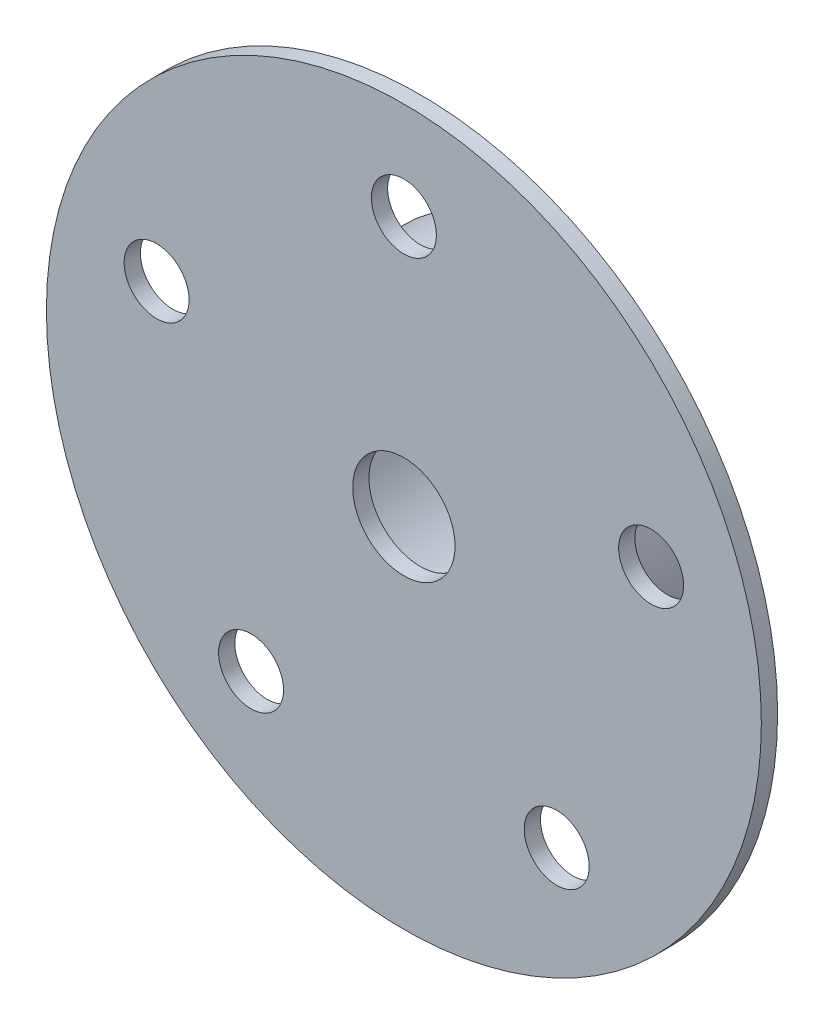
ISO-10303-21;
HEADER;
FILE_DESCRIPTION(('STEP AP214'),'2;1');
FILE_NAME('part.step','',(''),(''),'','','');
FILE_SCHEMA(('AUTOMOTIVE_DESIGN { 1 0 10303 214 1 1 1 1 }'));
ENDSEC;
DATA;
#1=APPLICATION_CONTEXT('core data for automotive mechanical design processes');
#2=APPLICATION_PROTOCOL_DEFINITION('international standard','automotive_design',2000,#1);
#3=PRODUCT_CONTEXT('',#1,'mechanical');
#4=PRODUCT('Part','Part','',(#3));
#5=PRODUCT_RELATED_PRODUCT_CATEGORY('part','',(#4));
#6=PRODUCT_DEFINITION_FORMATION('','',#4);
#7=PRODUCT_DEFINITION_CONTEXT('part definition',#1,'design');
#8=PRODUCT_DEFINITION('design','',#6,#7);
#9=PRODUCT_DEFINITION_SHAPE('','',#8);
#10=(LENGTH_UNIT() NAMED_UNIT(*) SI_UNIT(.MILLI.,.METRE.));
#11=(NAMED_UNIT(*) PLANE_ANGLE_UNIT() SI_UNIT($,.RADIAN.));
#12=(NAMED_UNIT(*) SI_UNIT($,.STERADIAN.) SOLID_ANGLE_UNIT());
#13=UNCERTAINTY_MEASURE_WITH_UNIT(LENGTH_MEASURE(1.E-05),#10,'distance_accuracy_value','');
#14=(GEOMETRIC_REPRESENTATION_CONTEXT(3) GLOBAL_UNCERTAINTY_ASSIGNED_CONTEXT((#13)) GLOBAL_UNIT_ASSIGNED_CONTEXT((#10,
#11,#12)) REPRESENTATION_CONTEXT('',''));
#15=CARTESIAN_POINT('',(0.,0.,0.));
#16=DIRECTION('',(0.,0.,1.));
#17=DIRECTION('',(1.,0.,0.));
#18=AXIS2_PLACEMENT_3D('',#15,#16,#17);
#19=CARTESIAN_POINT('',(0.,0.,0.));
#20=DIRECTION('',(0.,0.,1.));
#21=DIRECTION('',(1.,0.,0.));
#22=AXIS2_PLACEMENT_3D('',#19,#20,#21);
#23=PLANE('',#22);
#24=CARTESIAN_POINT('',(0.,0.,0.));
#25=DIRECTION('',(0.,0.,1.));
#26=DIRECTION('',(1.,0.,0.));
#27=AXIS2_PLACEMENT_3D('',#24,#25,#26);
#28=CIRCLE('',#27,3.15);
#29=CARTESIAN_POINT('',(3.15,0.,0.));
#30=VERTEX_POINT('',#29);
#31=EDGE_CURVE('E63',#30,#30,#28,.T.);
#32=ORIENTED_EDGE('',*,*,#31,.T.);
#33=EDGE_LOOP('',(#32));
#34=FACE_BOUND('',#33,.T.);
#35=CARTESIAN_POINT('',(0.,0.,0.));
#36=DIRECTION('',(0.,0.,-1.));
#37=DIRECTION('',(-1.,0.,0.));
#38=AXIS2_PLACEMENT_3D('',#35,#36,#37);
#39=CIRCLE('',#38,7.6);
#40=CARTESIAN_POINT('',(-7.6,0.,0.));
#41=VERTEX_POINT('',#40);
#42=EDGE_CURVE('E90',#41,#41,#39,.T.);
#43=ORIENTED_EDGE('',*,*,#42,.T.);
#44=EDGE_LOOP('',(#43));
#45=FACE_BOUND('',#44,.T.);
#46=ADVANCED_FACE('F33',(#34,#45),#23,.F.);
#47=CARTESIAN_POINT('',(0.,0.,1.));
#48=DIRECTION('',(0.,0.,1.));
#49=DIRECTION('',(1.,0.,0.));
#50=AXIS2_PLACEMENT_3D('',#47,#48,#49);
#51=PLANE('',#50);
#52=CARTESIAN_POINT('',(-9.40456403667834,-12.9442719099996,1.));
#53=DIRECTION('',(0.,0.,1.));
#54=DIRECTION('',(1.,0.,0.));
#55=AXIS2_PLACEMENT_3D('',#52,#53,#54);
#56=CIRCLE('',#55,2.00000000000142);
#57=CARTESIAN_POINT('',(-7.40456403667692,-12.9442719099996,1.));
#58=VERTEX_POINT('',#57);
#59=EDGE_CURVE('E72',#58,#58,#56,.T.);
#60=ORIENTED_EDGE('',*,*,#59,.F.);
#61=EDGE_LOOP('',(#60));
#62=FACE_BOUND('',#61,.T.);
#63=CARTESIAN_POINT('',(0.,0.,1.));
#64=DIRECTION('',(0.,0.,1.));
#65=DIRECTION('',(1.,0.,0.));
#66=AXIS2_PLACEMENT_3D('',#63,#64,#65);
#67=CIRCLE('',#66,3.15);
#68=CARTESIAN_POINT('',(3.15,0.,1.));
#69=VERTEX_POINT('',#68);
#70=EDGE_CURVE('E60',#69,#69,#67,.T.);
#71=ORIENTED_EDGE('',*,*,#70,.F.);
#72=EDGE_LOOP('',(#71));
#73=FACE_BOUND('',#72,.T.);
#74=CARTESIAN_POINT('',(0.,16.,1.));
#75=DIRECTION('',(0.,0.,1.));
#76=DIRECTION('',(1.,0.,0.));
#77=AXIS2_PLACEMENT_3D('',#74,#75,#76);
#78=CIRCLE('',#77,2.);
#79=CARTESIAN_POINT('',(2.,16.,1.));
#80=VERTEX_POINT('',#79);
#81=EDGE_CURVE('E49',#80,#80,#78,.T.);
#82=ORIENTED_EDGE('',*,*,#81,.F.);
#83=EDGE_LOOP('',(#82));
#84=FACE_BOUND('',#83,.T.);
#85=CARTESIAN_POINT('',(0.,0.,1.));
#86=DIRECTION('',(0.,0.,1.));
#87=DIRECTION('',(1.,0.,0.));
#88=AXIS2_PLACEMENT_3D('',#85,#86,#87);
#89=CIRCLE('',#88,22.);
#90=CARTESIAN_POINT('',(22.,0.,1.));
#91=VERTEX_POINT('',#90);
#92=EDGE_CURVE('E40',#91,#91,#89,.T.);
#93=ORIENTED_EDGE('',*,*,#92,.T.);
#94=EDGE_LOOP('',(#93));
#95=FACE_BOUND('',#94,.T.);
#96=CARTESIAN_POINT('',(15.2169042607229,4.94427190999981,1.));
#97=DIRECTION('',(0.,0.,1.));
#98=DIRECTION('',(1.,0.,0.));
#99=AXIS2_PLACEMENT_3D('',#96,#97,#98);
#100=CIRCLE('',#99,2.00000000000031);
#101=CARTESIAN_POINT('',(17.2169042607232,4.94427190999981,1.));
#102=VERTEX_POINT('',#101);
#103=EDGE_CURVE('E54',#102,#102,#100,.T.);
#104=ORIENTED_EDGE('',*,*,#103,.F.);
#105=EDGE_LOOP('',(#104));
#106=FACE_BOUND('',#105,.T.);
#107=CARTESIAN_POINT('',(9.4045640366808,-12.9442719099988,1.));
#108=DIRECTION('',(0.,0.,1.));
#109=DIRECTION('',(1.,0.,0.));
#110=AXIS2_PLACEMENT_3D('',#107,#108,#109);
#111=CIRCLE('',#110,2.00000000000115);
#112=CARTESIAN_POINT('',(11.4045640366819,-12.9442719099988,1.));
#113=VERTEX_POINT('',#112);
#114=EDGE_CURVE('E66',#113,#113,#111,.T.);
#115=ORIENTED_EDGE('',*,*,#114,.F.);
#116=EDGE_LOOP('',(#115));
#117=FACE_BOUND('',#116,.T.);
#118=CARTESIAN_POINT('',(-15.216904260722,4.94427190999851,1.));
#119=DIRECTION('',(0.,0.,1.));
#120=DIRECTION('',(1.,0.,0.));
#121=AXIS2_PLACEMENT_3D('',#118,#119,#120);
#122=CIRCLE('',#121,2.00000000000081);
#123=CARTESIAN_POINT('',(-13.2169042607212,4.94427190999851,1.));
#124=VERTEX_POINT('',#123);
#125=EDGE_CURVE('E78',#124,#124,#122,.T.);
#126=ORIENTED_EDGE('',*,*,#125,.F.);
#127=EDGE_LOOP('',(#126));
#128=FACE_BOUND('',#127,.T.);
#129=ADVANCED_FACE('F116',(#62,#73,#84,#95,#106,#117,#128),#51,.T.);
#130=CARTESIAN_POINT('',(0.,0.,0.));
#131=DIRECTION('',(0.,0.,1.));
#132=DIRECTION('',(1.,0.,0.));
#133=AXIS2_PLACEMENT_3D('',#130,#131,#132);
#134=CIRCLE('',#133,11.);
#135=CARTESIAN_POINT('',(11.,0.,0.));
#136=VERTEX_POINT('',#135);
#137=EDGE_CURVE('E10',#136,#136,#134,.F.);
#138=ORIENTED_EDGE('',*,*,#137,.F.);
#139=EDGE_LOOP('',(#138));
#140=FACE_BOUND('',#139,.T.);
#141=CARTESIAN_POINT('',(0.,0.,0.));
#142=DIRECTION('',(0.,0.,1.));
#143=DIRECTION('',(1.,0.,0.));
#144=AXIS2_PLACEMENT_3D('',#141,#142,#143);
#145=CIRCLE('',#144,22.);
#146=CARTESIAN_POINT('',(22.,0.,0.));
#147=VERTEX_POINT('',#146);
#148=EDGE_CURVE('E44',#147,#147,#145,.T.);
#149=ORIENTED_EDGE('',*,*,#148,.F.);
#150=EDGE_LOOP('',(#149));
#151=FACE_BOUND('',#150,.T.);
#152=CARTESIAN_POINT('',(0.,16.,0.));
#153=DIRECTION('',(0.,0.,1.));
#154=DIRECTION('',(1.,0.,0.));
#155=AXIS2_PLACEMENT_3D('',#152,#153,#154);
#156=CIRCLE('',#155,2.);
#157=CARTESIAN_POINT('',(2.,16.,0.));
#158=VERTEX_POINT('',#157);
#159=EDGE_CURVE('E51',#158,#158,#156,.T.);
#160=ORIENTED_EDGE('',*,*,#159,.T.);
#161=EDGE_LOOP('',(#160));
#162=FACE_BOUND('',#161,.T.);
#163=CARTESIAN_POINT('',(15.2169042607229,4.94427190999981,0.));
#164=DIRECTION('',(0.,0.,1.));
#165=DIRECTION('',(1.,0.,0.));
#166=AXIS2_PLACEMENT_3D('',#163,#164,#165);
#167=CIRCLE('',#166,2.00000000000031);
#168=CARTESIAN_POINT('',(17.2169042607232,4.94427190999981,0.));
#169=VERTEX_POINT('',#168);
#170=EDGE_CURVE('E57',#169,#169,#167,.T.);
#171=ORIENTED_EDGE('',*,*,#170,.T.);
#172=EDGE_LOOP('',(#171));
#173=FACE_BOUND('',#172,.T.);
#174=CARTESIAN_POINT('',(9.4045640366808,-12.9442719099988,0.));
#175=DIRECTION('',(0.,0.,1.));
#176=DIRECTION('',(1.,0.,0.));
#177=AXIS2_PLACEMENT_3D('',#174,#175,#176);
#178=CIRCLE('',#177,2.00000000000115);
#179=CARTESIAN_POINT('',(11.4045640366819,-12.9442719099988,0.));
#180=VERTEX_POINT('',#179);
#181=EDGE_CURVE('E69',#180,#180,#178,.T.);
#182=ORIENTED_EDGE('',*,*,#181,.T.);
#183=EDGE_LOOP('',(#182));
#184=FACE_BOUND('',#183,.T.);
#185=CARTESIAN_POINT('',(-9.40456403667834,-12.9442719099996,0.));
#186=DIRECTION('',(0.,0.,1.));
#187=DIRECTION('',(1.,0.,0.));
#188=AXIS2_PLACEMENT_3D('',#185,#186,#187);
#189=CIRCLE('',#188,2.00000000000142);
#190=CARTESIAN_POINT('',(-7.40456403667692,-12.9442719099996,0.));
#191=VERTEX_POINT('',#190);
#192=EDGE_CURVE('E75',#191,#191,#189,.T.);
#193=ORIENTED_EDGE('',*,*,#192,.T.);
#194=EDGE_LOOP('',(#193));
#195=FACE_BOUND('',#194,.T.);
#196=CARTESIAN_POINT('',(-15.216904260722,4.94427190999851,0.));
#197=DIRECTION('',(0.,0.,1.));
#198=DIRECTION('',(1.,0.,0.));
#199=AXIS2_PLACEMENT_3D('',#196,#197,#198);
#200=CIRCLE('',#199,2.00000000000081);
#201=CARTESIAN_POINT('',(-13.2169042607212,4.94427190999851,0.));
#202=VERTEX_POINT('',#201);
#203=EDGE_CURVE('E81',#202,#202,#200,.T.);
#204=ORIENTED_EDGE('',*,*,#203,.T.);
#205=EDGE_LOOP('',(#204));
#206=FACE_BOUND('',#205,.T.);
#207=ADVANCED_FACE('F118',(#140,#151,#162,#173,#184,#195,#206),#23,.F.);
#208=CARTESIAN_POINT('',(0.,0.,1.));
#209=DIRECTION('',(0.,0.,-1.));
#210=DIRECTION('',(-1.,0.,0.));
#211=AXIS2_PLACEMENT_3D('',#208,#209,#210);
#212=CYLINDRICAL_SURFACE('',#211,22.);
#213=ORIENTED_EDGE('',*,*,#92,.F.);
#214=EDGE_LOOP('',(#213));
#215=FACE_BOUND('',#214,.T.);
#216=ORIENTED_EDGE('',*,*,#148,.T.);
#217=EDGE_LOOP('',(#216));
#218=FACE_BOUND('',#217,.T.);
#219=ADVANCED_FACE('F35',(#215,#218),#212,.T.);
#220=CARTESIAN_POINT('',(0.,16.,1.));
#221=DIRECTION('',(0.,0.,-1.));
#222=DIRECTION('',(-1.,0.,0.));
#223=AXIS2_PLACEMENT_3D('',#220,#221,#222);
#224=CYLINDRICAL_SURFACE('',#223,2.);
#225=ORIENTED_EDGE('',*,*,#81,.T.);
#226=EDGE_LOOP('',(#225));
#227=FACE_BOUND('',#226,.T.);
#228=ORIENTED_EDGE('',*,*,#159,.F.);
#229=EDGE_LOOP('',(#228));
#230=FACE_BOUND('',#229,.T.);
#231=ADVANCED_FACE('F130',(#227,#230),#224,.F.);
#232=CARTESIAN_POINT('',(15.2169042607229,4.94427190999981,1.));
#233=DIRECTION('',(0.,0.,-1.));
#234=DIRECTION('',(-1.,0.,0.));
#235=AXIS2_PLACEMENT_3D('',#232,#233,#234);
#236=CYLINDRICAL_SURFACE('',#235,2.00000000000031);
#237=ORIENTED_EDGE('',*,*,#103,.T.);
#238=EDGE_LOOP('',(#237));
#239=FACE_BOUND('',#238,.T.);
#240=ORIENTED_EDGE('',*,*,#170,.F.);
#241=EDGE_LOOP('',(#240));
#242=FACE_BOUND('',#241,.T.);
#243=ADVANCED_FACE('F159',(#239,#242),#236,.F.);
#244=CARTESIAN_POINT('',(0.,0.,1.));
#245=DIRECTION('',(0.,0.,-1.));
#246=DIRECTION('',(-1.,0.,0.));
#247=AXIS2_PLACEMENT_3D('',#244,#245,#246);
#248=CYLINDRICAL_SURFACE('',#247,3.15);
#249=ORIENTED_EDGE('',*,*,#70,.T.);
#250=EDGE_LOOP('',(#249));
#251=FACE_BOUND('',#250,.T.);
#252=ORIENTED_EDGE('',*,*,#31,.F.);
#253=EDGE_LOOP('',(#252));
#254=FACE_BOUND('',#253,.T.);
#255=ADVANCED_FACE('F153',(#251,#254),#248,.F.);
#256=CARTESIAN_POINT('',(9.4045640366808,-12.9442719099988,1.));
#257=DIRECTION('',(0.,0.,-1.));
#258=DIRECTION('',(-1.,0.,0.));
#259=AXIS2_PLACEMENT_3D('',#256,#257,#258);
#260=CYLINDRICAL_SURFACE('',#259,2.00000000000115);
#261=ORIENTED_EDGE('',*,*,#114,.T.);
#262=EDGE_LOOP('',(#261));
#263=FACE_BOUND('',#262,.T.);
#264=ORIENTED_EDGE('',*,*,#181,.F.);
#265=EDGE_LOOP('',(#264));
#266=FACE_BOUND('',#265,.T.);
#267=ADVANCED_FACE('F147',(#263,#266),#260,.F.);
#268=CARTESIAN_POINT('',(-9.40456403667834,-12.9442719099996,1.));
#269=DIRECTION('',(0.,0.,-1.));
#270=DIRECTION('',(-1.,0.,0.));
#271=AXIS2_PLACEMENT_3D('',#268,#269,#270);
#272=CYLINDRICAL_SURFACE('',#271,2.00000000000142);
#273=ORIENTED_EDGE('',*,*,#59,.T.);
#274=EDGE_LOOP('',(#273));
#275=FACE_BOUND('',#274,.T.);
#276=ORIENTED_EDGE('',*,*,#192,.F.);
#277=EDGE_LOOP('',(#276));
#278=FACE_BOUND('',#277,.T.);
#279=ADVANCED_FACE('F111',(#275,#278),#272,.F.);
#280=CARTESIAN_POINT('',(-15.216904260722,4.94427190999851,1.));
#281=DIRECTION('',(0.,0.,-1.));
#282=DIRECTION('',(-1.,0.,0.));
#283=AXIS2_PLACEMENT_3D('',#280,#281,#282);
#284=CYLINDRICAL_SURFACE('',#283,2.00000000000081);
#285=ORIENTED_EDGE('',*,*,#125,.T.);
#286=EDGE_LOOP('',(#285));
#287=FACE_BOUND('',#286,.T.);
#288=ORIENTED_EDGE('',*,*,#203,.F.);
#289=EDGE_LOOP('',(#288));
#290=FACE_BOUND('',#289,.T.);
#291=ADVANCED_FACE('F102',(#287,#290),#284,.F.);
#292=CARTESIAN_POINT('',(0.,0.,-7.));
#293=DIRECTION('',(0.,0.,-1.));
#294=DIRECTION('',(-1.,0.,0.));
#295=AXIS2_PLACEMENT_3D('',#292,#293,#294);
#296=PLANE('',#295);
#297=CARTESIAN_POINT('',(0.,0.,-7.));
#298=DIRECTION('',(0.,0.,-1.));
#299=DIRECTION('',(-1.,0.,0.));
#300=AXIS2_PLACEMENT_3D('',#297,#298,#299);
#301=CIRCLE('',#300,11.);
#302=CARTESIAN_POINT('',(-11.,0.,-7.));
#303=VERTEX_POINT('',#302);
#304=EDGE_CURVE('E84',#303,#303,#301,.T.);
#305=ORIENTED_EDGE('',*,*,#304,.T.);
#306=EDGE_LOOP('',(#305));
#307=FACE_BOUND('',#306,.T.);
#308=CARTESIAN_POINT('',(0.,0.,-7.));
#309=DIRECTION('',(0.,0.,-1.));
#310=DIRECTION('',(-1.,0.,0.));
#311=AXIS2_PLACEMENT_3D('',#308,#309,#310);
#312=CIRCLE('',#311,7.6);
#313=CARTESIAN_POINT('',(-7.6,0.,-7.));
#314=VERTEX_POINT('',#313);
#315=EDGE_CURVE('E89',#314,#314,#312,.T.);
#316=ORIENTED_EDGE('',*,*,#315,.F.);
#317=EDGE_LOOP('',(#316));
#318=FACE_BOUND('',#317,.T.);
#319=ADVANCED_FACE('F99',(#307,#318),#296,.T.);
#320=CARTESIAN_POINT('',(0.,0.,-7.));
#321=DIRECTION('',(0.,0.,1.));
#322=DIRECTION('',(1.,0.,0.));
#323=AXIS2_PLACEMENT_3D('',#320,#321,#322);
#324=CYLINDRICAL_SURFACE('',#323,11.);
#325=ORIENTED_EDGE('',*,*,#304,.F.);
#326=EDGE_LOOP('',(#325));
#327=FACE_BOUND('',#326,.T.);
#328=ORIENTED_EDGE('',*,*,#137,.T.);
#329=EDGE_LOOP('',(#328));
#330=FACE_BOUND('',#329,.T.);
#331=ADVANCED_FACE('F101',(#327,#330),#324,.T.);
#332=CARTESIAN_POINT('',(0.,0.,-7.));
#333=DIRECTION('',(0.,0.,1.));
#334=DIRECTION('',(1.,0.,0.));
#335=AXIS2_PLACEMENT_3D('',#332,#333,#334);
#336=CYLINDRICAL_SURFACE('',#335,7.6);
#337=ORIENTED_EDGE('',*,*,#315,.T.);
#338=EDGE_LOOP('',(#337));
#339=FACE_BOUND('',#338,.T.);
#340=ORIENTED_EDGE('',*,*,#42,.F.);
#341=EDGE_LOOP('',(#340));
#342=FACE_BOUND('',#341,.T.);
#343=ADVANCED_FACE('F96',(#339,#342),#336,.F.);
#344=CLOSED_SHELL('',(#46,#129,#207,#219,#231,#243,#255,#267,#279,#291,#319,#331,#343));
#345=MANIFOLD_SOLID_BREP('B2',#344);
#346=ADVANCED_BREP_SHAPE_REPRESENTATION('',(#18,#345),#14);
#347=SHAPE_DEFINITION_REPRESENTATION(#9,#346);
ENDSEC;
END-ISO-10303-21;
